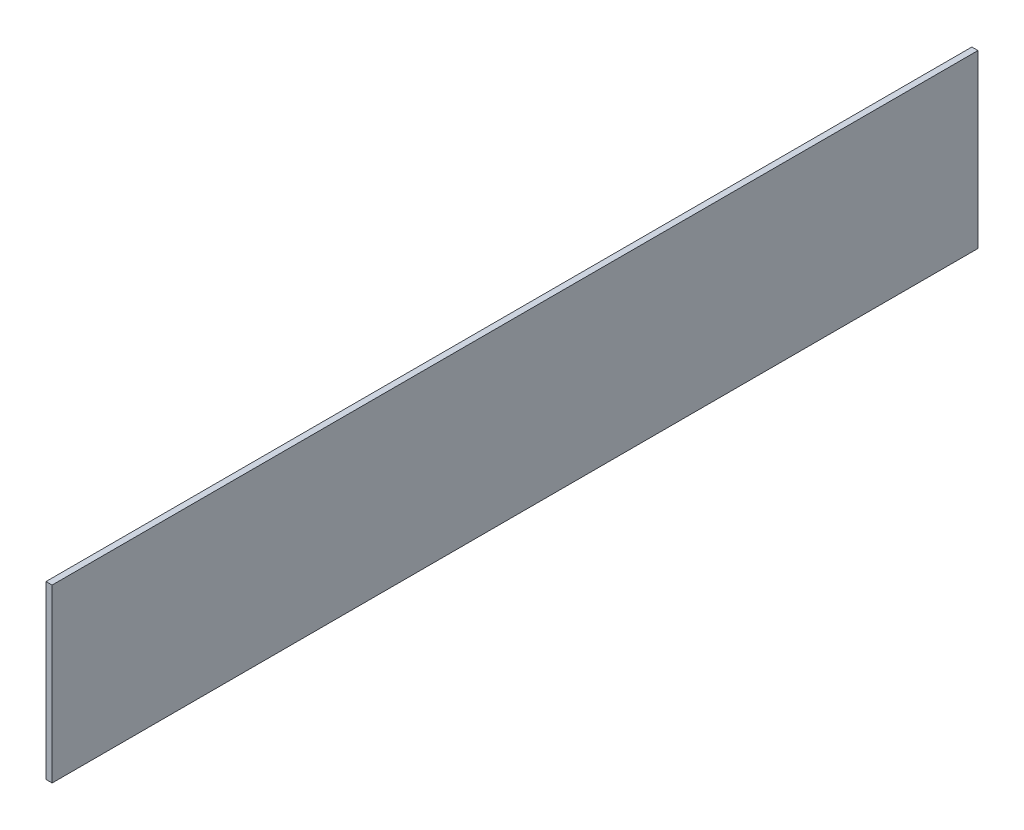
ISO-10303-21;
HEADER;
FILE_DESCRIPTION(('STEP AP214'),'2;1');
FILE_NAME('part.step','',(''),(''),'','','');
FILE_SCHEMA(('AUTOMOTIVE_DESIGN { 1 0 10303 214 1 1 1 1 }'));
ENDSEC;
DATA;
#1=APPLICATION_CONTEXT('core data for automotive mechanical design processes');
#2=APPLICATION_PROTOCOL_DEFINITION('international standard','automotive_design',2000,#1);
#3=PRODUCT_CONTEXT('',#1,'mechanical');
#4=PRODUCT('Part','Part','',(#3));
#5=PRODUCT_RELATED_PRODUCT_CATEGORY('part','',(#4));
#6=PRODUCT_DEFINITION_FORMATION('','',#4);
#7=PRODUCT_DEFINITION_CONTEXT('part definition',#1,'design');
#8=PRODUCT_DEFINITION('design','',#6,#7);
#9=PRODUCT_DEFINITION_SHAPE('','',#8);
#10=(LENGTH_UNIT() NAMED_UNIT(*) SI_UNIT(.MILLI.,.METRE.));
#11=(NAMED_UNIT(*) PLANE_ANGLE_UNIT() SI_UNIT($,.RADIAN.));
#12=(NAMED_UNIT(*) SI_UNIT($,.STERADIAN.) SOLID_ANGLE_UNIT());
#13=UNCERTAINTY_MEASURE_WITH_UNIT(LENGTH_MEASURE(1.E-05),#10,'distance_accuracy_value','');
#14=(GEOMETRIC_REPRESENTATION_CONTEXT(3) GLOBAL_UNCERTAINTY_ASSIGNED_CONTEXT((#13)) GLOBAL_UNIT_ASSIGNED_CONTEXT((#10,
#11,#12)) REPRESENTATION_CONTEXT('',''));
#15=CARTESIAN_POINT('',(0.,0.,0.));
#16=DIRECTION('',(0.,0.,1.));
#17=DIRECTION('',(1.,0.,0.));
#18=AXIS2_PLACEMENT_3D('',#15,#16,#17);
#19=CARTESIAN_POINT('',(1.5875,22.225,120.015));
#20=DIRECTION('',(0.,0.,-1.));
#21=DIRECTION('',(-1.,0.,0.));
#22=AXIS2_PLACEMENT_3D('',#19,#20,#21);
#23=PLANE('',#22);
#24=DIRECTION('',(0.,-1.,0.));
#25=VECTOR('',#24,1.);
#26=CARTESIAN_POINT('',(0.,22.225,120.015));
#27=LINE('',#26,#25);
#28=CARTESIAN_POINT('',(0.,22.225,120.015));
#29=VERTEX_POINT('',#28);
#30=CARTESIAN_POINT('',(0.,-22.225,120.015));
#31=VERTEX_POINT('',#30);
#32=EDGE_CURVE('E111',#29,#31,#27,.T.);
#33=ORIENTED_EDGE('',*,*,#32,.T.);
#34=DIRECTION('',(-1.,0.,0.));
#35=VECTOR('',#34,1.);
#36=CARTESIAN_POINT('',(1.5875,-22.225,120.015));
#37=LINE('',#36,#35);
#38=CARTESIAN_POINT('',(1.5875,-22.225,120.015));
#39=VERTEX_POINT('',#38);
#40=EDGE_CURVE('E11',#39,#31,#37,.T.);
#41=ORIENTED_EDGE('',*,*,#40,.F.);
#42=DIRECTION('',(0.,-1.,0.));
#43=VECTOR('',#42,1.);
#44=CARTESIAN_POINT('',(1.5875,22.225,120.015));
#45=LINE('',#44,#43);
#46=CARTESIAN_POINT('',(1.5875,22.225,120.015));
#47=VERTEX_POINT('',#46);
#48=EDGE_CURVE('E95',#47,#39,#45,.T.);
#49=ORIENTED_EDGE('',*,*,#48,.F.);
#50=DIRECTION('',(-1.,0.,0.));
#51=VECTOR('',#50,1.);
#52=CARTESIAN_POINT('',(1.5875,22.225,120.015));
#53=LINE('',#52,#51);
#54=EDGE_CURVE('E107',#47,#29,#53,.T.);
#55=ORIENTED_EDGE('',*,*,#54,.T.);
#56=EDGE_LOOP('',(#33,#41,#49,#55));
#57=FACE_BOUND('',#56,.T.);
#58=ADVANCED_FACE('F43',(#57),#23,.F.);
#59=CARTESIAN_POINT('',(1.5875,-22.225,-120.015));
#60=DIRECTION('',(0.,1.,0.));
#61=DIRECTION('',(0.,0.,1.));
#62=AXIS2_PLACEMENT_3D('',#59,#60,#61);
#63=PLANE('',#62);
#64=DIRECTION('',(0.,0.,-1.));
#65=VECTOR('',#64,1.);
#66=CARTESIAN_POINT('',(0.,-22.225,-120.015));
#67=LINE('',#66,#65);
#68=CARTESIAN_POINT('',(0.,-22.225,-120.015));
#69=VERTEX_POINT('',#68);
#70=EDGE_CURVE('E100',#31,#69,#67,.T.);
#71=ORIENTED_EDGE('',*,*,#70,.T.);
#72=DIRECTION('',(-1.,0.,0.));
#73=VECTOR('',#72,1.);
#74=CARTESIAN_POINT('',(1.5875,-22.225,-120.015));
#75=LINE('',#74,#73);
#76=CARTESIAN_POINT('',(1.5875,-22.225,-120.015));
#77=VERTEX_POINT('',#76);
#78=EDGE_CURVE('E52',#77,#69,#75,.T.);
#79=ORIENTED_EDGE('',*,*,#78,.F.);
#80=DIRECTION('',(0.,0.,-1.));
#81=VECTOR('',#80,1.);
#82=CARTESIAN_POINT('',(1.5875,-22.225,-120.015));
#83=LINE('',#82,#81);
#84=EDGE_CURVE('E90',#39,#77,#83,.T.);
#85=ORIENTED_EDGE('',*,*,#84,.F.);
#86=ORIENTED_EDGE('',*,*,#40,.T.);
#87=EDGE_LOOP('',(#71,#79,#85,#86));
#88=FACE_BOUND('',#87,.T.);
#89=ADVANCED_FACE('F99',(#88),#63,.F.);
#90=CARTESIAN_POINT('',(1.5875,22.225,-120.015));
#91=DIRECTION('',(0.,0.,1.));
#92=DIRECTION('',(1.,0.,0.));
#93=AXIS2_PLACEMENT_3D('',#90,#91,#92);
#94=PLANE('',#93);
#95=DIRECTION('',(0.,1.,0.));
#96=VECTOR('',#95,1.);
#97=CARTESIAN_POINT('',(0.,22.225,-120.015));
#98=LINE('',#97,#96);
#99=CARTESIAN_POINT('',(0.,22.225,-120.015));
#100=VERTEX_POINT('',#99);
#101=EDGE_CURVE('E77',#69,#100,#98,.T.);
#102=ORIENTED_EDGE('',*,*,#101,.T.);
#103=DIRECTION('',(-1.,0.,0.));
#104=VECTOR('',#103,1.);
#105=CARTESIAN_POINT('',(1.5875,22.225,-120.015));
#106=LINE('',#105,#104);
#107=CARTESIAN_POINT('',(1.5875,22.225,-120.015));
#108=VERTEX_POINT('',#107);
#109=EDGE_CURVE('E102',#108,#100,#106,.T.);
#110=ORIENTED_EDGE('',*,*,#109,.F.);
#111=DIRECTION('',(0.,1.,0.));
#112=VECTOR('',#111,1.);
#113=CARTESIAN_POINT('',(1.5875,22.225,-120.015));
#114=LINE('',#113,#112);
#115=EDGE_CURVE('E93',#77,#108,#114,.T.);
#116=ORIENTED_EDGE('',*,*,#115,.F.);
#117=ORIENTED_EDGE('',*,*,#78,.T.);
#118=EDGE_LOOP('',(#102,#110,#116,#117));
#119=FACE_BOUND('',#118,.T.);
#120=ADVANCED_FACE('F103',(#119),#94,.F.);
#121=CARTESIAN_POINT('',(1.5875,22.225,-120.015));
#122=DIRECTION('',(0.,-1.,0.));
#123=DIRECTION('',(0.,0.,-1.));
#124=AXIS2_PLACEMENT_3D('',#121,#122,#123);
#125=PLANE('',#124);
#126=DIRECTION('',(0.,0.,1.));
#127=VECTOR('',#126,1.);
#128=CARTESIAN_POINT('',(0.,22.225,-120.015));
#129=LINE('',#128,#127);
#130=EDGE_CURVE('E83',#100,#29,#129,.T.);
#131=ORIENTED_EDGE('',*,*,#130,.T.);
#132=ORIENTED_EDGE('',*,*,#54,.F.);
#133=DIRECTION('',(0.,0.,1.));
#134=VECTOR('',#133,1.);
#135=CARTESIAN_POINT('',(1.5875,22.225,-120.015));
#136=LINE('',#135,#134);
#137=EDGE_CURVE('E60',#108,#47,#136,.T.);
#138=ORIENTED_EDGE('',*,*,#137,.F.);
#139=ORIENTED_EDGE('',*,*,#109,.T.);
#140=EDGE_LOOP('',(#131,#132,#138,#139));
#141=FACE_BOUND('',#140,.T.);
#142=ADVANCED_FACE('F124',(#141),#125,.F.);
#143=CARTESIAN_POINT('',(1.5875,0.,0.));
#144=DIRECTION('',(-1.,0.,0.));
#145=DIRECTION('',(0.,0.,1.));
#146=AXIS2_PLACEMENT_3D('',#143,#144,#145);
#147=PLANE('',#146);
#148=ORIENTED_EDGE('',*,*,#48,.T.);
#149=ORIENTED_EDGE('',*,*,#84,.T.);
#150=ORIENTED_EDGE('',*,*,#115,.T.);
#151=ORIENTED_EDGE('',*,*,#137,.T.);
#152=EDGE_LOOP('',(#148,#149,#150,#151));
#153=FACE_BOUND('',#152,.T.);
#154=ADVANCED_FACE('F91',(#153),#147,.F.);
#155=CARTESIAN_POINT('',(0.,0.,0.));
#156=DIRECTION('',(-1.,0.,0.));
#157=DIRECTION('',(0.,0.,1.));
#158=AXIS2_PLACEMENT_3D('',#155,#156,#157);
#159=PLANE('',#158);
#160=ORIENTED_EDGE('',*,*,#32,.F.);
#161=ORIENTED_EDGE('',*,*,#130,.F.);
#162=ORIENTED_EDGE('',*,*,#101,.F.);
#163=ORIENTED_EDGE('',*,*,#70,.F.);
#164=EDGE_LOOP('',(#160,#161,#162,#163));
#165=FACE_BOUND('',#164,.T.);
#166=ADVANCED_FACE('F127',(#165),#159,.T.);
#167=CLOSED_SHELL('',(#58,#89,#120,#142,#154,#166));
#168=MANIFOLD_SOLID_BREP('B2',#167);
#169=ADVANCED_BREP_SHAPE_REPRESENTATION('',(#18,#168),#14);
#170=SHAPE_DEFINITION_REPRESENTATION(#9,#169);
ENDSEC;
END-ISO-10303-21;
